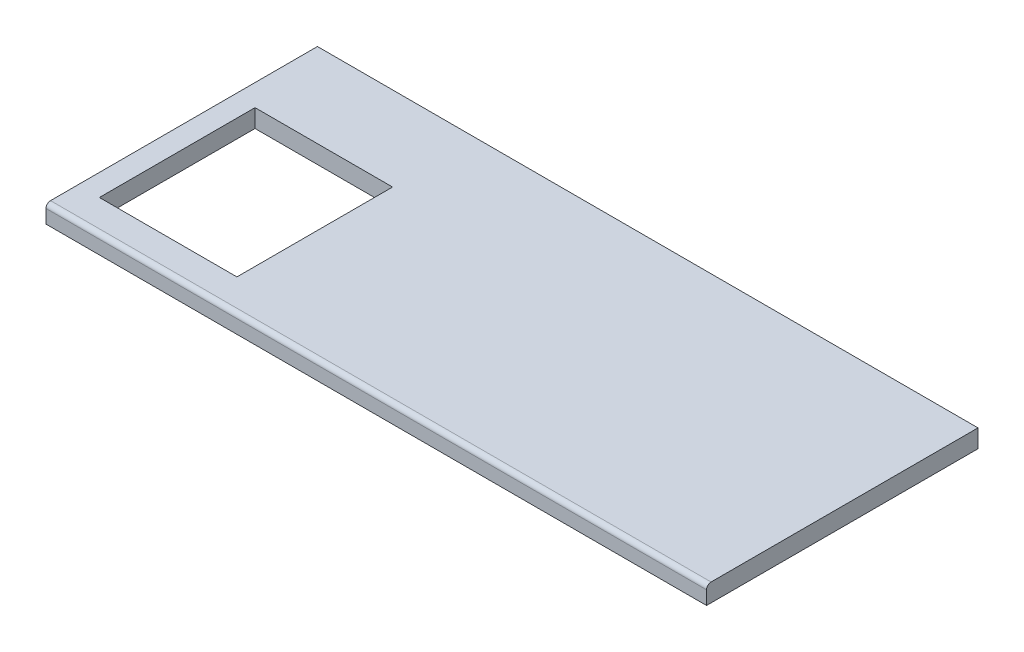
ISO-10303-21;
HEADER;
FILE_DESCRIPTION(('STEP AP214'),'2;1');
FILE_NAME('part.step','',(''),(''),'','','');
FILE_SCHEMA(('AUTOMOTIVE_DESIGN { 1 0 10303 214 1 1 1 1 }'));
ENDSEC;
DATA;
#1=APPLICATION_CONTEXT('core data for automotive mechanical design processes');
#2=APPLICATION_PROTOCOL_DEFINITION('international standard','automotive_design',2000,#1);
#3=PRODUCT_CONTEXT('',#1,'mechanical');
#4=PRODUCT('Part','Part','',(#3));
#5=PRODUCT_RELATED_PRODUCT_CATEGORY('part','',(#4));
#6=PRODUCT_DEFINITION_FORMATION('','',#4);
#7=PRODUCT_DEFINITION_CONTEXT('part definition',#1,'design');
#8=PRODUCT_DEFINITION('design','',#6,#7);
#9=PRODUCT_DEFINITION_SHAPE('','',#8);
#10=(LENGTH_UNIT() NAMED_UNIT(*) SI_UNIT(.MILLI.,.METRE.));
#11=(NAMED_UNIT(*) PLANE_ANGLE_UNIT() SI_UNIT($,.RADIAN.));
#12=(NAMED_UNIT(*) SI_UNIT($,.STERADIAN.) SOLID_ANGLE_UNIT());
#13=UNCERTAINTY_MEASURE_WITH_UNIT(LENGTH_MEASURE(1.E-05),#10,'distance_accuracy_value','');
#14=(GEOMETRIC_REPRESENTATION_CONTEXT(3) GLOBAL_UNCERTAINTY_ASSIGNED_CONTEXT((#13)) GLOBAL_UNIT_ASSIGNED_CONTEXT((#10,
#11,#12)) REPRESENTATION_CONTEXT('',''));
#15=CARTESIAN_POINT('',(0.,0.,0.));
#16=DIRECTION('',(0.,0.,1.));
#17=DIRECTION('',(1.,0.,0.));
#18=AXIS2_PLACEMENT_3D('',#15,#16,#17);
#19=CARTESIAN_POINT('',(730.,40.,-300.));
#20=DIRECTION('',(-1.,0.,0.));
#21=DIRECTION('',(0.,0.,1.));
#22=AXIS2_PLACEMENT_3D('',#19,#20,#21);
#23=PLANE('',#22);
#24=DIRECTION('',(0.,0.,-1.));
#25=VECTOR('',#24,1.);
#26=CARTESIAN_POINT('',(730.,40.,-300.));
#27=LINE('',#26,#25);
#28=CARTESIAN_POINT('',(730.,40.,290.));
#29=VERTEX_POINT('',#28);
#30=CARTESIAN_POINT('',(730.,40.,-300.));
#31=VERTEX_POINT('',#30);
#32=EDGE_CURVE('E157',#29,#31,#27,.T.);
#33=ORIENTED_EDGE('',*,*,#32,.F.);
#34=CARTESIAN_POINT('',(730.,30.,290.));
#35=DIRECTION('',(-1.,0.,0.));
#36=DIRECTION('',(0.,0.,1.));
#37=AXIS2_PLACEMENT_3D('',#34,#35,#36);
#38=CIRCLE('',#37,10.);
#39=CARTESIAN_POINT('',(730.,30.,300.));
#40=VERTEX_POINT('',#39);
#41=EDGE_CURVE('E199',#29,#40,#38,.F.);
#42=ORIENTED_EDGE('',*,*,#41,.T.);
#43=DIRECTION('',(0.,-1.,0.));
#44=VECTOR('',#43,1.);
#45=CARTESIAN_POINT('',(730.,40.,300.));
#46=LINE('',#45,#44);
#47=CARTESIAN_POINT('',(730.,0.,300.));
#48=VERTEX_POINT('',#47);
#49=EDGE_CURVE('E168',#40,#48,#46,.T.);
#50=ORIENTED_EDGE('',*,*,#49,.T.);
#51=DIRECTION('',(0.,0.,-1.));
#52=VECTOR('',#51,1.);
#53=CARTESIAN_POINT('',(730.,0.,-300.));
#54=LINE('',#53,#52);
#55=CARTESIAN_POINT('',(730.,0.,-300.));
#56=VERTEX_POINT('',#55);
#57=EDGE_CURVE('E125',#48,#56,#54,.T.);
#58=ORIENTED_EDGE('',*,*,#57,.T.);
#59=DIRECTION('',(0.,-1.,0.));
#60=VECTOR('',#59,1.);
#61=CARTESIAN_POINT('',(730.,40.,-300.));
#62=LINE('',#61,#60);
#63=EDGE_CURVE('E191',#31,#56,#62,.T.);
#64=ORIENTED_EDGE('',*,*,#63,.F.);
#65=EDGE_LOOP('',(#33,#42,#50,#58,#64));
#66=FACE_BOUND('',#65,.T.);
#67=ADVANCED_FACE('F38',(#66),#23,.F.);
#68=CARTESIAN_POINT('',(-730.,40.,-300.));
#69=DIRECTION('',(0.,0.,1.));
#70=DIRECTION('',(1.,0.,0.));
#71=AXIS2_PLACEMENT_3D('',#68,#69,#70);
#72=PLANE('',#71);
#73=DIRECTION('',(-1.,0.,0.));
#74=VECTOR('',#73,1.);
#75=CARTESIAN_POINT('',(-730.,0.,-300.));
#76=LINE('',#75,#74);
#77=CARTESIAN_POINT('',(-730.,0.,-300.));
#78=VERTEX_POINT('',#77);
#79=EDGE_CURVE('E172',#56,#78,#76,.T.);
#80=ORIENTED_EDGE('',*,*,#79,.T.);
#81=DIRECTION('',(0.,-1.,0.));
#82=VECTOR('',#81,1.);
#83=CARTESIAN_POINT('',(-730.,40.,-300.));
#84=LINE('',#83,#82);
#85=CARTESIAN_POINT('',(-730.,40.,-300.));
#86=VERTEX_POINT('',#85);
#87=EDGE_CURVE('E187',#86,#78,#84,.T.);
#88=ORIENTED_EDGE('',*,*,#87,.F.);
#89=DIRECTION('',(-1.,0.,0.));
#90=VECTOR('',#89,1.);
#91=CARTESIAN_POINT('',(-730.,40.,-300.));
#92=LINE('',#91,#90);
#93=EDGE_CURVE('E160',#31,#86,#92,.T.);
#94=ORIENTED_EDGE('',*,*,#93,.F.);
#95=ORIENTED_EDGE('',*,*,#63,.T.);
#96=EDGE_LOOP('',(#80,#88,#94,#95));
#97=FACE_BOUND('',#96,.T.);
#98=ADVANCED_FACE('F223',(#97),#72,.F.);
#99=CARTESIAN_POINT('',(-730.,40.,-300.));
#100=DIRECTION('',(1.,0.,0.));
#101=DIRECTION('',(0.,0.,-1.));
#102=AXIS2_PLACEMENT_3D('',#99,#100,#101);
#103=PLANE('',#102);
#104=DIRECTION('',(0.,-1.,0.));
#105=VECTOR('',#104,1.);
#106=CARTESIAN_POINT('',(-730.,40.,300.));
#107=LINE('',#106,#105);
#108=CARTESIAN_POINT('',(-730.,30.,300.));
#109=VERTEX_POINT('',#108);
#110=CARTESIAN_POINT('',(-730.,0.,300.));
#111=VERTEX_POINT('',#110);
#112=EDGE_CURVE('E184',#109,#111,#107,.T.);
#113=ORIENTED_EDGE('',*,*,#112,.F.);
#114=CARTESIAN_POINT('',(-730.,30.,290.));
#115=DIRECTION('',(1.,0.,0.));
#116=DIRECTION('',(0.,0.,-1.));
#117=AXIS2_PLACEMENT_3D('',#114,#115,#116);
#118=CIRCLE('',#117,10.);
#119=CARTESIAN_POINT('',(-730.,40.,290.));
#120=VERTEX_POINT('',#119);
#121=EDGE_CURVE('E11',#109,#120,#118,.F.);
#122=ORIENTED_EDGE('',*,*,#121,.T.);
#123=DIRECTION('',(0.,0.,1.));
#124=VECTOR('',#123,1.);
#125=CARTESIAN_POINT('',(-730.,40.,-300.));
#126=LINE('',#125,#124);
#127=EDGE_CURVE('E164',#86,#120,#126,.T.);
#128=ORIENTED_EDGE('',*,*,#127,.F.);
#129=ORIENTED_EDGE('',*,*,#87,.T.);
#130=DIRECTION('',(0.,0.,1.));
#131=VECTOR('',#130,1.);
#132=CARTESIAN_POINT('',(-730.,0.,-300.));
#133=LINE('',#132,#131);
#134=EDGE_CURVE('E175',#78,#111,#133,.T.);
#135=ORIENTED_EDGE('',*,*,#134,.T.);
#136=EDGE_LOOP('',(#113,#122,#128,#129,#135));
#137=FACE_BOUND('',#136,.T.);
#138=ADVANCED_FACE('F210',(#137),#103,.F.);
#139=CARTESIAN_POINT('',(-730.,40.,300.));
#140=DIRECTION('',(0.,0.,-1.));
#141=DIRECTION('',(-1.,0.,0.));
#142=AXIS2_PLACEMENT_3D('',#139,#140,#141);
#143=PLANE('',#142);
#144=ORIENTED_EDGE('',*,*,#49,.F.);
#145=DIRECTION('',(1.,0.,0.));
#146=VECTOR('',#145,1.);
#147=CARTESIAN_POINT('',(-730.,30.,300.));
#148=LINE('',#147,#146);
#149=EDGE_CURVE('E47',#40,#109,#148,.F.);
#150=ORIENTED_EDGE('',*,*,#149,.T.);
#151=ORIENTED_EDGE('',*,*,#112,.T.);
#152=DIRECTION('',(1.,0.,0.));
#153=VECTOR('',#152,1.);
#154=CARTESIAN_POINT('',(-730.,0.,300.));
#155=LINE('',#154,#153);
#156=EDGE_CURVE('E161',#111,#48,#155,.T.);
#157=ORIENTED_EDGE('',*,*,#156,.T.);
#158=EDGE_LOOP('',(#144,#150,#151,#157));
#159=FACE_BOUND('',#158,.T.);
#160=ADVANCED_FACE('F206',(#159),#143,.F.);
#161=CARTESIAN_POINT('',(0.,40.,0.));
#162=DIRECTION('',(0.,1.,0.));
#163=DIRECTION('',(0.,0.,1.));
#164=AXIS2_PLACEMENT_3D('',#161,#162,#163);
#165=PLANE('',#164);
#166=DIRECTION('',(0.,0.,-1.));
#167=VECTOR('',#166,1.);
#168=CARTESIAN_POINT('',(-378.,40.,-114.));
#169=LINE('',#168,#167);
#170=CARTESIAN_POINT('',(-378.,40.,230.));
#171=VERTEX_POINT('',#170);
#172=CARTESIAN_POINT('',(-378.,40.,-114.));
#173=VERTEX_POINT('',#172);
#174=EDGE_CURVE('E54',#171,#173,#169,.T.);
#175=ORIENTED_EDGE('',*,*,#174,.F.);
#176=DIRECTION('',(1.,0.,0.));
#177=VECTOR('',#176,1.);
#178=CARTESIAN_POINT('',(-682.,40.,230.));
#179=LINE('',#178,#177);
#180=CARTESIAN_POINT('',(-682.,40.,230.));
#181=VERTEX_POINT('',#180);
#182=EDGE_CURVE('E118',#181,#171,#179,.T.);
#183=ORIENTED_EDGE('',*,*,#182,.F.);
#184=DIRECTION('',(0.,0.,1.));
#185=VECTOR('',#184,1.);
#186=CARTESIAN_POINT('',(-682.,40.,-114.));
#187=LINE('',#186,#185);
#188=CARTESIAN_POINT('',(-682.,40.,-114.));
#189=VERTEX_POINT('',#188);
#190=EDGE_CURVE('E143',#189,#181,#187,.T.);
#191=ORIENTED_EDGE('',*,*,#190,.F.);
#192=DIRECTION('',(-1.,0.,0.));
#193=VECTOR('',#192,1.);
#194=CARTESIAN_POINT('',(-682.,40.,-114.));
#195=LINE('',#194,#193);
#196=EDGE_CURVE('E136',#173,#189,#195,.T.);
#197=ORIENTED_EDGE('',*,*,#196,.F.);
#198=EDGE_LOOP('',(#175,#183,#191,#197));
#199=FACE_BOUND('',#198,.T.);
#200=ORIENTED_EDGE('',*,*,#127,.T.);
#201=DIRECTION('',(1.,0.,0.));
#202=VECTOR('',#201,1.);
#203=CARTESIAN_POINT('',(730.,40.,290.));
#204=LINE('',#203,#202);
#205=EDGE_CURVE('E195',#120,#29,#204,.T.);
#206=ORIENTED_EDGE('',*,*,#205,.T.);
#207=ORIENTED_EDGE('',*,*,#32,.T.);
#208=ORIENTED_EDGE('',*,*,#93,.T.);
#209=EDGE_LOOP('',(#200,#206,#207,#208));
#210=FACE_BOUND('',#209,.T.);
#211=ADVANCED_FACE('F217',(#199,#210),#165,.T.);
#212=CARTESIAN_POINT('',(0.,0.,0.));
#213=DIRECTION('',(0.,1.,0.));
#214=DIRECTION('',(0.,0.,1.));
#215=AXIS2_PLACEMENT_3D('',#212,#213,#214);
#216=PLANE('',#215);
#217=DIRECTION('',(-1.,0.,0.));
#218=VECTOR('',#217,1.);
#219=CARTESIAN_POINT('',(-682.,0.,230.));
#220=LINE('',#219,#218);
#221=CARTESIAN_POINT('',(-378.,0.,230.));
#222=VERTEX_POINT('',#221);
#223=CARTESIAN_POINT('',(-682.,0.,230.));
#224=VERTEX_POINT('',#223);
#225=EDGE_CURVE('E131',#222,#224,#220,.T.);
#226=ORIENTED_EDGE('',*,*,#225,.F.);
#227=DIRECTION('',(0.,0.,1.));
#228=VECTOR('',#227,1.);
#229=CARTESIAN_POINT('',(-378.,0.,-114.));
#230=LINE('',#229,#228);
#231=CARTESIAN_POINT('',(-378.,0.,-114.));
#232=VERTEX_POINT('',#231);
#233=EDGE_CURVE('E111',#232,#222,#230,.T.);
#234=ORIENTED_EDGE('',*,*,#233,.F.);
#235=DIRECTION('',(1.,0.,0.));
#236=VECTOR('',#235,1.);
#237=CARTESIAN_POINT('',(-682.,0.,-114.));
#238=LINE('',#237,#236);
#239=CARTESIAN_POINT('',(-682.,0.,-114.));
#240=VERTEX_POINT('',#239);
#241=EDGE_CURVE('E121',#240,#232,#238,.T.);
#242=ORIENTED_EDGE('',*,*,#241,.F.);
#243=DIRECTION('',(0.,0.,-1.));
#244=VECTOR('',#243,1.);
#245=CARTESIAN_POINT('',(-682.,0.,-114.));
#246=LINE('',#245,#244);
#247=EDGE_CURVE('E62',#224,#240,#246,.T.);
#248=ORIENTED_EDGE('',*,*,#247,.F.);
#249=EDGE_LOOP('',(#226,#234,#242,#248));
#250=FACE_BOUND('',#249,.T.);
#251=ORIENTED_EDGE('',*,*,#57,.F.);
#252=ORIENTED_EDGE('',*,*,#156,.F.);
#253=ORIENTED_EDGE('',*,*,#134,.F.);
#254=ORIENTED_EDGE('',*,*,#79,.F.);
#255=EDGE_LOOP('',(#251,#252,#253,#254));
#256=FACE_BOUND('',#255,.T.);
#257=ADVANCED_FACE('F128',(#250,#256),#216,.F.);
#258=CARTESIAN_POINT('',(0.,30.,290.));
#259=DIRECTION('',(-1.,0.,0.));
#260=DIRECTION('',(0.,0.,1.));
#261=AXIS2_PLACEMENT_3D('',#258,#259,#260);
#262=CYLINDRICAL_SURFACE('',#261,10.);
#263=ORIENTED_EDGE('',*,*,#121,.F.);
#264=ORIENTED_EDGE('',*,*,#149,.F.);
#265=ORIENTED_EDGE('',*,*,#41,.F.);
#266=ORIENTED_EDGE('',*,*,#205,.F.);
#267=EDGE_LOOP('',(#263,#264,#265,#266));
#268=FACE_BOUND('',#267,.T.);
#269=ADVANCED_FACE('F40',(#268),#262,.T.);
#270=CARTESIAN_POINT('',(-378.,-0.001000000000001,-114.));
#271=DIRECTION('',(1.,0.,0.));
#272=DIRECTION('',(0.,0.,-1.));
#273=AXIS2_PLACEMENT_3D('',#270,#271,#272);
#274=PLANE('',#273);
#275=ORIENTED_EDGE('',*,*,#233,.T.);
#276=DIRECTION('',(0.,1.,0.));
#277=VECTOR('',#276,1.);
#278=CARTESIAN_POINT('',(-378.,-0.001000000000001,230.));
#279=LINE('',#278,#277);
#280=EDGE_CURVE('E126',#222,#171,#279,.T.);
#281=ORIENTED_EDGE('',*,*,#280,.T.);
#282=ORIENTED_EDGE('',*,*,#174,.T.);
#283=DIRECTION('',(0.,1.,0.));
#284=VECTOR('',#283,1.);
#285=CARTESIAN_POINT('',(-378.,-0.001000000000001,-114.));
#286=LINE('',#285,#284);
#287=EDGE_CURVE('E107',#232,#173,#286,.T.);
#288=ORIENTED_EDGE('',*,*,#287,.F.);
#289=EDGE_LOOP('',(#275,#281,#282,#288));
#290=FACE_BOUND('',#289,.T.);
#291=ADVANCED_FACE('F109',(#290),#274,.F.);
#292=CARTESIAN_POINT('',(-682.,-0.001000000000001,230.));
#293=DIRECTION('',(0.,0.,1.));
#294=DIRECTION('',(1.,0.,0.));
#295=AXIS2_PLACEMENT_3D('',#292,#293,#294);
#296=PLANE('',#295);
#297=ORIENTED_EDGE('',*,*,#225,.T.);
#298=DIRECTION('',(0.,1.,0.));
#299=VECTOR('',#298,1.);
#300=CARTESIAN_POINT('',(-682.,-0.001000000000001,230.));
#301=LINE('',#300,#299);
#302=EDGE_CURVE('E152',#224,#181,#301,.T.);
#303=ORIENTED_EDGE('',*,*,#302,.T.);
#304=ORIENTED_EDGE('',*,*,#182,.T.);
#305=ORIENTED_EDGE('',*,*,#280,.F.);
#306=EDGE_LOOP('',(#297,#303,#304,#305));
#307=FACE_BOUND('',#306,.T.);
#308=ADVANCED_FACE('F266',(#307),#296,.F.);
#309=CARTESIAN_POINT('',(-682.,-0.001000000000001,-114.));
#310=DIRECTION('',(-1.,0.,0.));
#311=DIRECTION('',(0.,0.,1.));
#312=AXIS2_PLACEMENT_3D('',#309,#310,#311);
#313=PLANE('',#312);
#314=ORIENTED_EDGE('',*,*,#247,.T.);
#315=DIRECTION('',(0.,1.,0.));
#316=VECTOR('',#315,1.);
#317=CARTESIAN_POINT('',(-682.,-0.001000000000001,-114.));
#318=LINE('',#317,#316);
#319=EDGE_CURVE('E117',#240,#189,#318,.T.);
#320=ORIENTED_EDGE('',*,*,#319,.T.);
#321=ORIENTED_EDGE('',*,*,#190,.T.);
#322=ORIENTED_EDGE('',*,*,#302,.F.);
#323=EDGE_LOOP('',(#314,#320,#321,#322));
#324=FACE_BOUND('',#323,.T.);
#325=ADVANCED_FACE('F273',(#324),#313,.F.);
#326=CARTESIAN_POINT('',(-682.,-0.001000000000001,-114.));
#327=DIRECTION('',(0.,0.,-1.));
#328=DIRECTION('',(-1.,0.,0.));
#329=AXIS2_PLACEMENT_3D('',#326,#327,#328);
#330=PLANE('',#329);
#331=ORIENTED_EDGE('',*,*,#241,.T.);
#332=ORIENTED_EDGE('',*,*,#287,.T.);
#333=ORIENTED_EDGE('',*,*,#196,.T.);
#334=ORIENTED_EDGE('',*,*,#319,.F.);
#335=EDGE_LOOP('',(#331,#332,#333,#334));
#336=FACE_BOUND('',#335,.T.);
#337=ADVANCED_FACE('F122',(#336),#330,.F.);
#338=CLOSED_SHELL('',(#67,#98,#138,#160,#211,#257,#269,#291,#308,#325,#337));
#339=MANIFOLD_SOLID_BREP('B2',#338);
#340=ADVANCED_BREP_SHAPE_REPRESENTATION('',(#18,#339),#14);
#341=SHAPE_DEFINITION_REPRESENTATION(#9,#340);
ENDSEC;
END-ISO-10303-21;
